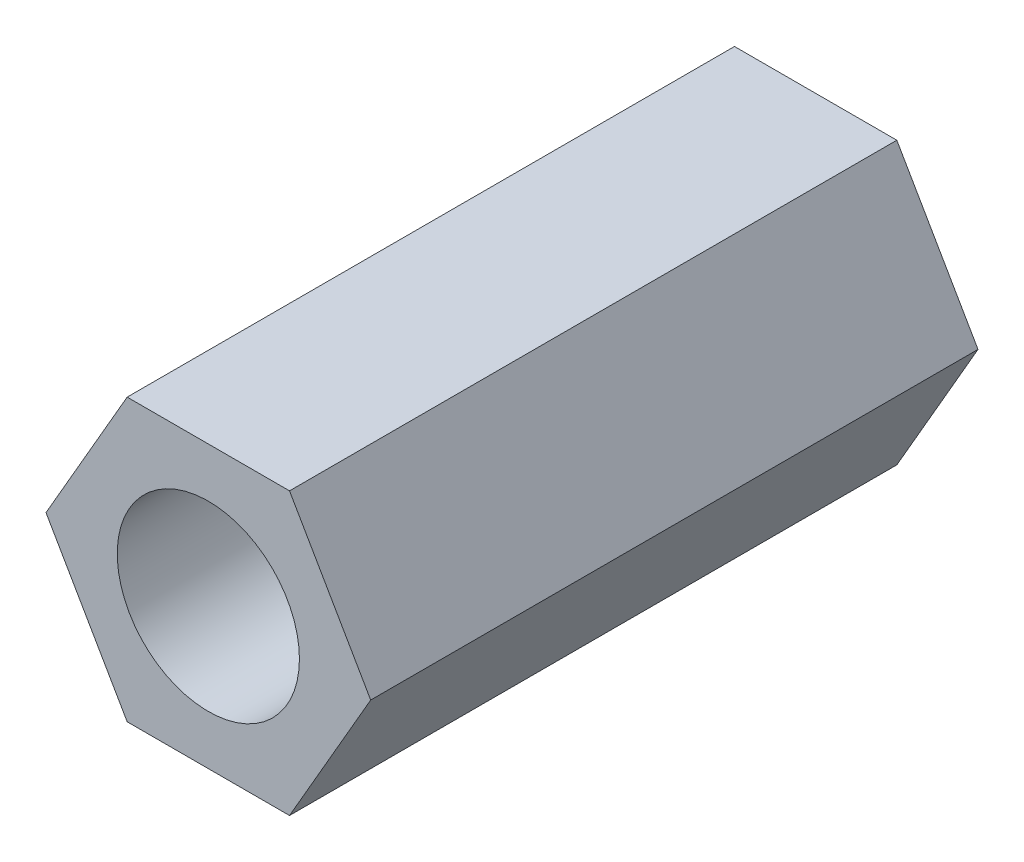
ISO-10303-21;
HEADER;
FILE_DESCRIPTION(('STEP AP214'),'2;1');
FILE_NAME('part.step','',(''),(''),'','','');
FILE_SCHEMA(('AUTOMOTIVE_DESIGN { 1 0 10303 214 1 1 1 1 }'));
ENDSEC;
DATA;
#1=APPLICATION_CONTEXT('core data for automotive mechanical design processes');
#2=APPLICATION_PROTOCOL_DEFINITION('international standard','automotive_design',2000,#1);
#3=PRODUCT_CONTEXT('',#1,'mechanical');
#4=PRODUCT('Part','Part','',(#3));
#5=PRODUCT_RELATED_PRODUCT_CATEGORY('part','',(#4));
#6=PRODUCT_DEFINITION_FORMATION('','',#4);
#7=PRODUCT_DEFINITION_CONTEXT('part definition',#1,'design');
#8=PRODUCT_DEFINITION('design','',#6,#7);
#9=PRODUCT_DEFINITION_SHAPE('','',#8);
#10=(LENGTH_UNIT() NAMED_UNIT(*) SI_UNIT(.MILLI.,.METRE.));
#11=(NAMED_UNIT(*) PLANE_ANGLE_UNIT() SI_UNIT($,.RADIAN.));
#12=(NAMED_UNIT(*) SI_UNIT($,.STERADIAN.) SOLID_ANGLE_UNIT());
#13=UNCERTAINTY_MEASURE_WITH_UNIT(LENGTH_MEASURE(1.E-05),#10,'distance_accuracy_value','');
#14=(GEOMETRIC_REPRESENTATION_CONTEXT(3) GLOBAL_UNCERTAINTY_ASSIGNED_CONTEXT((#13)) GLOBAL_UNIT_ASSIGNED_CONTEXT((#10,
#11,#12)) REPRESENTATION_CONTEXT('',''));
#15=CARTESIAN_POINT('',(0.,0.,0.));
#16=DIRECTION('',(0.,0.,1.));
#17=DIRECTION('',(1.,0.,0.));
#18=AXIS2_PLACEMENT_3D('',#15,#16,#17);
#19=CARTESIAN_POINT('',(0.,0.,10.));
#20=DIRECTION('',(0.,0.,1.));
#21=DIRECTION('',(1.,0.,0.));
#22=AXIS2_PLACEMENT_3D('',#19,#20,#21);
#23=PLANE('',#22);
#24=DIRECTION('',(0.5,0.866025403784439,0.));
#25=VECTOR('',#24,1.);
#26=CARTESIAN_POINT('',(1.33656587317398,-2.315,10.));
#27=LINE('',#26,#25);
#28=CARTESIAN_POINT('',(1.33656587317398,-2.315,10.));
#29=VERTEX_POINT('',#28);
#30=CARTESIAN_POINT('',(2.67313174634797,0.,10.));
#31=VERTEX_POINT('',#30);
#32=EDGE_CURVE('E146',#29,#31,#27,.T.);
#33=ORIENTED_EDGE('',*,*,#32,.T.);
#34=DIRECTION('',(-0.5,0.866025403784438,0.));
#35=VECTOR('',#34,1.);
#36=CARTESIAN_POINT('',(2.67313174634797,0.,10.));
#37=LINE('',#36,#35);
#38=CARTESIAN_POINT('',(1.33656587317398,2.315,10.));
#39=VERTEX_POINT('',#38);
#40=EDGE_CURVE('E94',#31,#39,#37,.T.);
#41=ORIENTED_EDGE('',*,*,#40,.T.);
#42=DIRECTION('',(-1.,0.,0.));
#43=VECTOR('',#42,1.);
#44=CARTESIAN_POINT('',(1.33656587317398,2.315,10.));
#45=LINE('',#44,#43);
#46=CARTESIAN_POINT('',(-1.33656587317398,2.315,10.));
#47=VERTEX_POINT('',#46);
#48=EDGE_CURVE('E107',#39,#47,#45,.T.);
#49=ORIENTED_EDGE('',*,*,#48,.T.);
#50=DIRECTION('',(-0.5,-0.866025403784438,0.));
#51=VECTOR('',#50,1.);
#52=CARTESIAN_POINT('',(-1.33656587317398,2.315,10.));
#53=LINE('',#52,#51);
#54=CARTESIAN_POINT('',(-2.67313174634797,0.,10.));
#55=VERTEX_POINT('',#54);
#56=EDGE_CURVE('E101',#47,#55,#53,.T.);
#57=ORIENTED_EDGE('',*,*,#56,.T.);
#58=DIRECTION('',(0.5,-0.866025403784439,0.));
#59=VECTOR('',#58,1.);
#60=CARTESIAN_POINT('',(-2.67313174634797,0.,10.));
#61=LINE('',#60,#59);
#62=CARTESIAN_POINT('',(-1.33656587317398,-2.315,10.));
#63=VERTEX_POINT('',#62);
#64=EDGE_CURVE('E105',#55,#63,#61,.T.);
#65=ORIENTED_EDGE('',*,*,#64,.T.);
#66=DIRECTION('',(1.,0.,0.));
#67=VECTOR('',#66,1.);
#68=CARTESIAN_POINT('',(-1.33656587317398,-2.315,10.));
#69=LINE('',#68,#67);
#70=EDGE_CURVE('E57',#63,#29,#69,.T.);
#71=ORIENTED_EDGE('',*,*,#70,.T.);
#72=EDGE_LOOP('',(#33,#41,#49,#57,#65,#71));
#73=FACE_BOUND('',#72,.T.);
#74=CARTESIAN_POINT('',(0.,0.,10.));
#75=DIRECTION('',(0.,0.,1.));
#76=DIRECTION('',(1.,0.,0.));
#77=AXIS2_PLACEMENT_3D('',#74,#75,#76);
#78=CIRCLE('',#77,1.5);
#79=CARTESIAN_POINT('',(1.5,0.,10.));
#80=VERTEX_POINT('',#79);
#81=EDGE_CURVE('E134',#80,#80,#78,.T.);
#82=ORIENTED_EDGE('',*,*,#81,.F.);
#83=EDGE_LOOP('',(#82));
#84=FACE_BOUND('',#83,.T.);
#85=ADVANCED_FACE('F39',(#73,#84),#23,.T.);
#86=CARTESIAN_POINT('',(0.,0.,0.));
#87=DIRECTION('',(0.,0.,1.));
#88=DIRECTION('',(1.,0.,0.));
#89=AXIS2_PLACEMENT_3D('',#86,#87,#88);
#90=PLANE('',#89);
#91=DIRECTION('',(0.5,0.866025403784439,0.));
#92=VECTOR('',#91,1.);
#93=CARTESIAN_POINT('',(1.33656587317398,-2.315,0.));
#94=LINE('',#93,#92);
#95=CARTESIAN_POINT('',(1.33656587317398,-2.315,0.));
#96=VERTEX_POINT('',#95);
#97=CARTESIAN_POINT('',(2.67313174634797,0.,0.));
#98=VERTEX_POINT('',#97);
#99=EDGE_CURVE('E129',#96,#98,#94,.T.);
#100=ORIENTED_EDGE('',*,*,#99,.F.);
#101=DIRECTION('',(1.,0.,0.));
#102=VECTOR('',#101,1.);
#103=CARTESIAN_POINT('',(-1.33656587317398,-2.315,0.));
#104=LINE('',#103,#102);
#105=CARTESIAN_POINT('',(-1.33656587317398,-2.315,0.));
#106=VERTEX_POINT('',#105);
#107=EDGE_CURVE('E86',#106,#96,#104,.T.);
#108=ORIENTED_EDGE('',*,*,#107,.F.);
#109=DIRECTION('',(0.5,-0.866025403784439,0.));
#110=VECTOR('',#109,1.);
#111=CARTESIAN_POINT('',(-2.67313174634797,0.,0.));
#112=LINE('',#111,#110);
#113=CARTESIAN_POINT('',(-2.67313174634797,0.,0.));
#114=VERTEX_POINT('',#113);
#115=EDGE_CURVE('E80',#114,#106,#112,.T.);
#116=ORIENTED_EDGE('',*,*,#115,.F.);
#117=DIRECTION('',(-0.5,-0.866025403784438,0.));
#118=VECTOR('',#117,1.);
#119=CARTESIAN_POINT('',(-1.33656587317398,2.315,0.));
#120=LINE('',#119,#118);
#121=CARTESIAN_POINT('',(-1.33656587317398,2.315,0.));
#122=VERTEX_POINT('',#121);
#123=EDGE_CURVE('E116',#122,#114,#120,.T.);
#124=ORIENTED_EDGE('',*,*,#123,.F.);
#125=DIRECTION('',(-1.,0.,0.));
#126=VECTOR('',#125,1.);
#127=CARTESIAN_POINT('',(1.33656587317398,2.315,0.));
#128=LINE('',#127,#126);
#129=CARTESIAN_POINT('',(1.33656587317398,2.315,0.));
#130=VERTEX_POINT('',#129);
#131=EDGE_CURVE('E137',#130,#122,#128,.T.);
#132=ORIENTED_EDGE('',*,*,#131,.F.);
#133=DIRECTION('',(-0.5,0.866025403784438,0.));
#134=VECTOR('',#133,1.);
#135=CARTESIAN_POINT('',(2.67313174634797,0.,0.));
#136=LINE('',#135,#134);
#137=EDGE_CURVE('E133',#98,#130,#136,.T.);
#138=ORIENTED_EDGE('',*,*,#137,.F.);
#139=EDGE_LOOP('',(#100,#108,#116,#124,#132,#138));
#140=FACE_BOUND('',#139,.T.);
#141=CARTESIAN_POINT('',(0.,0.,0.));
#142=DIRECTION('',(0.,0.,1.));
#143=DIRECTION('',(1.,0.,0.));
#144=AXIS2_PLACEMENT_3D('',#141,#142,#143);
#145=CIRCLE('',#144,1.5);
#146=CARTESIAN_POINT('',(1.5,0.,0.));
#147=VERTEX_POINT('',#146);
#148=EDGE_CURVE('E243',#147,#147,#145,.T.);
#149=ORIENTED_EDGE('',*,*,#148,.T.);
#150=EDGE_LOOP('',(#149));
#151=FACE_BOUND('',#150,.T.);
#152=ADVANCED_FACE('F159',(#140,#151),#90,.F.);
#153=CARTESIAN_POINT('',(1.33656587317398,-2.315,10.));
#154=DIRECTION('',(-0.866025403784439,0.5,0.));
#155=DIRECTION('',(-0.5,-0.866025403784439,0.));
#156=AXIS2_PLACEMENT_3D('',#153,#154,#155);
#157=PLANE('',#156);
#158=ORIENTED_EDGE('',*,*,#99,.T.);
#159=DIRECTION('',(0.,0.,-1.));
#160=VECTOR('',#159,1.);
#161=CARTESIAN_POINT('',(2.67313174634797,0.,10.));
#162=LINE('',#161,#160);
#163=EDGE_CURVE('E11',#31,#98,#162,.T.);
#164=ORIENTED_EDGE('',*,*,#163,.F.);
#165=ORIENTED_EDGE('',*,*,#32,.F.);
#166=DIRECTION('',(0.,0.,-1.));
#167=VECTOR('',#166,1.);
#168=CARTESIAN_POINT('',(1.33656587317398,-2.315,10.));
#169=LINE('',#168,#167);
#170=EDGE_CURVE('E125',#29,#96,#169,.T.);
#171=ORIENTED_EDGE('',*,*,#170,.T.);
#172=EDGE_LOOP('',(#158,#164,#165,#171));
#173=FACE_BOUND('',#172,.T.);
#174=ADVANCED_FACE('F41',(#173),#157,.F.);
#175=CARTESIAN_POINT('',(2.67313174634797,0.,10.));
#176=DIRECTION('',(-0.866025403784438,-0.5,0.));
#177=DIRECTION('',(0.5,-0.866025403784439,0.));
#178=AXIS2_PLACEMENT_3D('',#175,#176,#177);
#179=PLANE('',#178);
#180=ORIENTED_EDGE('',*,*,#137,.T.);
#181=DIRECTION('',(0.,0.,-1.));
#182=VECTOR('',#181,1.);
#183=CARTESIAN_POINT('',(1.33656587317398,2.315,10.));
#184=LINE('',#183,#182);
#185=EDGE_CURVE('E49',#39,#130,#184,.T.);
#186=ORIENTED_EDGE('',*,*,#185,.F.);
#187=ORIENTED_EDGE('',*,*,#40,.F.);
#188=ORIENTED_EDGE('',*,*,#163,.T.);
#189=EDGE_LOOP('',(#180,#186,#187,#188));
#190=FACE_BOUND('',#189,.T.);
#191=ADVANCED_FACE('F184',(#190),#179,.F.);
#192=CARTESIAN_POINT('',(1.33656587317398,2.315,10.));
#193=DIRECTION('',(0.,-1.,0.));
#194=DIRECTION('',(0.,0.,-1.));
#195=AXIS2_PLACEMENT_3D('',#192,#193,#194);
#196=PLANE('',#195);
#197=ORIENTED_EDGE('',*,*,#131,.T.);
#198=DIRECTION('',(0.,0.,-1.));
#199=VECTOR('',#198,1.);
#200=CARTESIAN_POINT('',(-1.33656587317398,2.315,10.));
#201=LINE('',#200,#199);
#202=EDGE_CURVE('E118',#47,#122,#201,.T.);
#203=ORIENTED_EDGE('',*,*,#202,.F.);
#204=ORIENTED_EDGE('',*,*,#48,.F.);
#205=ORIENTED_EDGE('',*,*,#185,.T.);
#206=EDGE_LOOP('',(#197,#203,#204,#205));
#207=FACE_BOUND('',#206,.T.);
#208=ADVANCED_FACE('F156',(#207),#196,.F.);
#209=CARTESIAN_POINT('',(-1.33656587317398,2.315,10.));
#210=DIRECTION('',(0.866025403784439,-0.5,0.));
#211=DIRECTION('',(0.5,0.866025403784439,0.));
#212=AXIS2_PLACEMENT_3D('',#209,#210,#211);
#213=PLANE('',#212);
#214=ORIENTED_EDGE('',*,*,#123,.T.);
#215=DIRECTION('',(0.,0.,-1.));
#216=VECTOR('',#215,1.);
#217=CARTESIAN_POINT('',(-2.67313174634797,0.,10.));
#218=LINE('',#217,#216);
#219=EDGE_CURVE('E113',#55,#114,#218,.T.);
#220=ORIENTED_EDGE('',*,*,#219,.F.);
#221=ORIENTED_EDGE('',*,*,#56,.F.);
#222=ORIENTED_EDGE('',*,*,#202,.T.);
#223=EDGE_LOOP('',(#214,#220,#221,#222));
#224=FACE_BOUND('',#223,.T.);
#225=ADVANCED_FACE('F114',(#224),#213,.F.);
#226=CARTESIAN_POINT('',(-2.67313174634797,0.,10.));
#227=DIRECTION('',(0.866025403784439,0.5,0.));
#228=DIRECTION('',(-0.5,0.866025403784439,0.));
#229=AXIS2_PLACEMENT_3D('',#226,#227,#228);
#230=PLANE('',#229);
#231=ORIENTED_EDGE('',*,*,#115,.T.);
#232=DIRECTION('',(0.,0.,-1.));
#233=VECTOR('',#232,1.);
#234=CARTESIAN_POINT('',(-1.33656587317398,-2.315,10.));
#235=LINE('',#234,#233);
#236=EDGE_CURVE('E119',#63,#106,#235,.T.);
#237=ORIENTED_EDGE('',*,*,#236,.F.);
#238=ORIENTED_EDGE('',*,*,#64,.F.);
#239=ORIENTED_EDGE('',*,*,#219,.T.);
#240=EDGE_LOOP('',(#231,#237,#238,#239));
#241=FACE_BOUND('',#240,.T.);
#242=ADVANCED_FACE('F121',(#241),#230,.F.);
#243=CARTESIAN_POINT('',(-1.33656587317398,-2.315,10.));
#244=DIRECTION('',(0.,1.,0.));
#245=DIRECTION('',(-1.,0.,0.));
#246=AXIS2_PLACEMENT_3D('',#243,#244,#245);
#247=PLANE('',#246);
#248=ORIENTED_EDGE('',*,*,#107,.T.);
#249=ORIENTED_EDGE('',*,*,#170,.F.);
#250=ORIENTED_EDGE('',*,*,#70,.F.);
#251=ORIENTED_EDGE('',*,*,#236,.T.);
#252=EDGE_LOOP('',(#248,#249,#250,#251));
#253=FACE_BOUND('',#252,.T.);
#254=ADVANCED_FACE('F164',(#253),#247,.F.);
#255=CARTESIAN_POINT('',(0.,0.,10.));
#256=DIRECTION('',(0.,0.,-1.));
#257=DIRECTION('',(-1.,0.,0.));
#258=AXIS2_PLACEMENT_3D('',#255,#256,#257);
#259=CYLINDRICAL_SURFACE('',#258,1.5);
#260=ORIENTED_EDGE('',*,*,#81,.T.);
#261=EDGE_LOOP('',(#260));
#262=FACE_BOUND('',#261,.T.);
#263=ORIENTED_EDGE('',*,*,#148,.F.);
#264=EDGE_LOOP('',(#263));
#265=FACE_BOUND('',#264,.T.);
#266=ADVANCED_FACE('F166',(#262,#265),#259,.F.);
#267=CLOSED_SHELL('',(#85,#152,#174,#191,#208,#225,#242,#254,#266));
#268=MANIFOLD_SOLID_BREP('B2',#267);
#269=ADVANCED_BREP_SHAPE_REPRESENTATION('',(#18,#268),#14);
#270=SHAPE_DEFINITION_REPRESENTATION(#9,#269);
ENDSEC;
END-ISO-10303-21;
